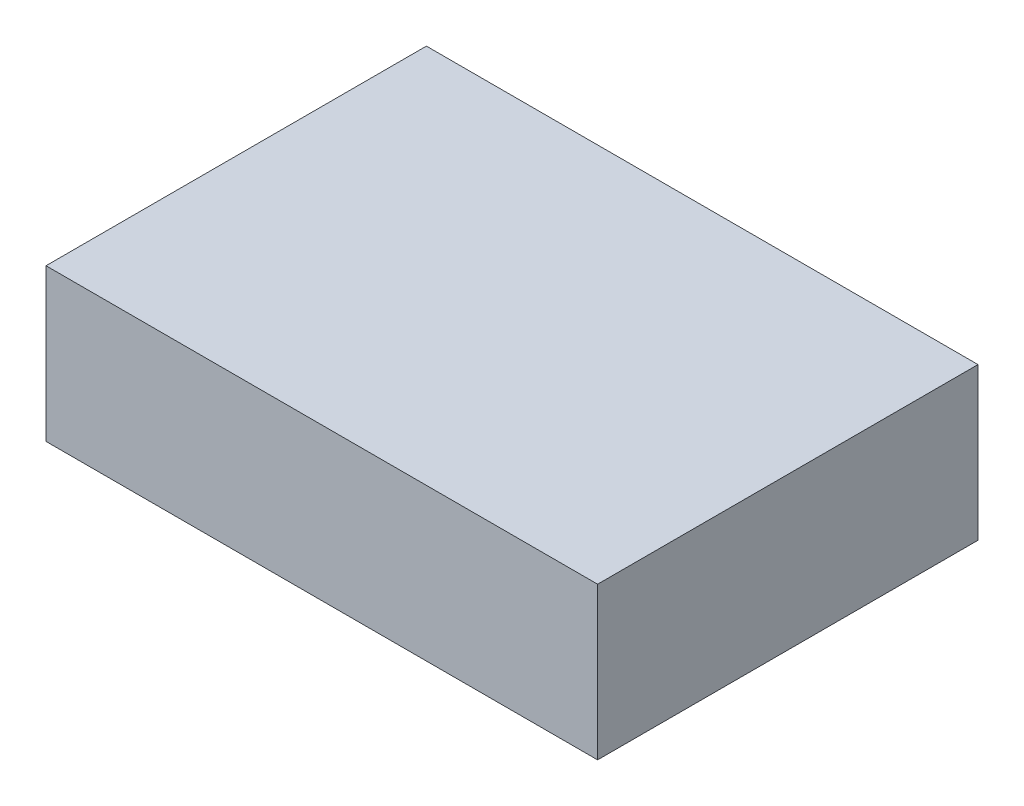
ISO-10303-21;
HEADER;
FILE_DESCRIPTION(('STEP AP214'),'2;1');
FILE_NAME('part.step','',(''),(''),'','','');
FILE_SCHEMA(('AUTOMOTIVE_DESIGN { 1 0 10303 214 1 1 1 1 }'));
ENDSEC;
DATA;
#1=APPLICATION_CONTEXT('core data for automotive mechanical design processes');
#2=APPLICATION_PROTOCOL_DEFINITION('international standard','automotive_design',2000,#1);
#3=PRODUCT_CONTEXT('',#1,'mechanical');
#4=PRODUCT('Part','Part','',(#3));
#5=PRODUCT_RELATED_PRODUCT_CATEGORY('part','',(#4));
#6=PRODUCT_DEFINITION_FORMATION('','',#4);
#7=PRODUCT_DEFINITION_CONTEXT('part definition',#1,'design');
#8=PRODUCT_DEFINITION('design','',#6,#7);
#9=PRODUCT_DEFINITION_SHAPE('','',#8);
#10=(LENGTH_UNIT() NAMED_UNIT(*) SI_UNIT(.MILLI.,.METRE.));
#11=(NAMED_UNIT(*) PLANE_ANGLE_UNIT() SI_UNIT($,.RADIAN.));
#12=(NAMED_UNIT(*) SI_UNIT($,.STERADIAN.) SOLID_ANGLE_UNIT());
#13=UNCERTAINTY_MEASURE_WITH_UNIT(LENGTH_MEASURE(1.E-05),#10,'distance_accuracy_value','');
#14=(GEOMETRIC_REPRESENTATION_CONTEXT(3) GLOBAL_UNCERTAINTY_ASSIGNED_CONTEXT((#13)) GLOBAL_UNIT_ASSIGNED_CONTEXT((#10,
#11,#12)) REPRESENTATION_CONTEXT('',''));
#15=CARTESIAN_POINT('',(0.,0.,0.));
#16=DIRECTION('',(0.,0.,1.));
#17=DIRECTION('',(1.,0.,0.));
#18=AXIS2_PLACEMENT_3D('',#15,#16,#17);
#19=CARTESIAN_POINT('',(0.,0.,0.));
#20=DIRECTION('',(0.,1.,0.));
#21=DIRECTION('',(1.,0.,0.));
#22=AXIS2_PLACEMENT_3D('',#19,#20,#21);
#23=PLANE('',#22);
#24=DIRECTION('',(0.,0.,-1.));
#25=VECTOR('',#24,1.);
#26=CARTESIAN_POINT('',(46.0375,0.,31.75));
#27=LINE('',#26,#25);
#28=CARTESIAN_POINT('',(46.0375,0.,31.75));
#29=VERTEX_POINT('',#28);
#30=CARTESIAN_POINT('',(46.0375,0.,-31.75));
#31=VERTEX_POINT('',#30);
#32=EDGE_CURVE('E21',#29,#31,#27,.T.);
#33=ORIENTED_EDGE('',*,*,#32,.F.);
#34=DIRECTION('',(1.,0.,0.));
#35=VECTOR('',#34,1.);
#36=CARTESIAN_POINT('',(-46.0375,0.,31.75));
#37=LINE('',#36,#35);
#38=CARTESIAN_POINT('',(-46.0375,0.,31.75));
#39=VERTEX_POINT('',#38);
#40=EDGE_CURVE('E73',#39,#29,#37,.T.);
#41=ORIENTED_EDGE('',*,*,#40,.F.);
#42=DIRECTION('',(0.,0.,1.));
#43=VECTOR('',#42,1.);
#44=CARTESIAN_POINT('',(-46.0375,0.,-31.75));
#45=LINE('',#44,#43);
#46=CARTESIAN_POINT('',(-46.0375,0.,-31.75));
#47=VERTEX_POINT('',#46);
#48=EDGE_CURVE('E94',#47,#39,#45,.T.);
#49=ORIENTED_EDGE('',*,*,#48,.F.);
#50=DIRECTION('',(-1.,0.,0.));
#51=VECTOR('',#50,1.);
#52=CARTESIAN_POINT('',(46.0375,0.,-31.75));
#53=LINE('',#52,#51);
#54=EDGE_CURVE('E74',#31,#47,#53,.T.);
#55=ORIENTED_EDGE('',*,*,#54,.F.);
#56=EDGE_LOOP('',(#33,#41,#49,#55));
#57=FACE_BOUND('',#56,.T.);
#58=ADVANCED_FACE('F17',(#57),#23,.F.);
#59=CARTESIAN_POINT('',(0.,25.4,0.));
#60=DIRECTION('',(0.,1.,0.));
#61=DIRECTION('',(1.,0.,0.));
#62=AXIS2_PLACEMENT_3D('',#59,#60,#61);
#63=PLANE('',#62);
#64=DIRECTION('',(0.,0.,-1.));
#65=VECTOR('',#64,1.);
#66=CARTESIAN_POINT('',(46.0375,25.4,31.75));
#67=LINE('',#66,#65);
#68=CARTESIAN_POINT('',(46.0375,25.4,31.75));
#69=VERTEX_POINT('',#68);
#70=CARTESIAN_POINT('',(46.0375,25.4,-31.75));
#71=VERTEX_POINT('',#70);
#72=EDGE_CURVE('E11',#69,#71,#67,.T.);
#73=ORIENTED_EDGE('',*,*,#72,.T.);
#74=DIRECTION('',(-1.,0.,0.));
#75=VECTOR('',#74,1.);
#76=CARTESIAN_POINT('',(46.0375,25.4,-31.75));
#77=LINE('',#76,#75);
#78=CARTESIAN_POINT('',(-46.0375,25.4,-31.75));
#79=VERTEX_POINT('',#78);
#80=EDGE_CURVE('E109',#71,#79,#77,.T.);
#81=ORIENTED_EDGE('',*,*,#80,.T.);
#82=DIRECTION('',(0.,0.,1.));
#83=VECTOR('',#82,1.);
#84=CARTESIAN_POINT('',(-46.0375,25.4,-31.75));
#85=LINE('',#84,#83);
#86=CARTESIAN_POINT('',(-46.0375,25.4,31.75));
#87=VERTEX_POINT('',#86);
#88=EDGE_CURVE('E100',#79,#87,#85,.T.);
#89=ORIENTED_EDGE('',*,*,#88,.T.);
#90=DIRECTION('',(1.,0.,0.));
#91=VECTOR('',#90,1.);
#92=CARTESIAN_POINT('',(-46.0375,25.4,31.75));
#93=LINE('',#92,#91);
#94=EDGE_CURVE('E83',#87,#69,#93,.T.);
#95=ORIENTED_EDGE('',*,*,#94,.T.);
#96=EDGE_LOOP('',(#73,#81,#89,#95));
#97=FACE_BOUND('',#96,.T.);
#98=ADVANCED_FACE('F19',(#97),#63,.T.);
#99=CARTESIAN_POINT('',(46.0375,0.,31.75));
#100=DIRECTION('',(1.,0.,0.));
#101=DIRECTION('',(0.,0.,-1.));
#102=AXIS2_PLACEMENT_3D('',#99,#100,#101);
#103=PLANE('',#102);
#104=ORIENTED_EDGE('',*,*,#32,.T.);
#105=DIRECTION('',(0.,1.,0.));
#106=VECTOR('',#105,1.);
#107=CARTESIAN_POINT('',(46.0375,0.,-31.75));
#108=LINE('',#107,#106);
#109=EDGE_CURVE('E76',#31,#71,#108,.T.);
#110=ORIENTED_EDGE('',*,*,#109,.T.);
#111=ORIENTED_EDGE('',*,*,#72,.F.);
#112=DIRECTION('',(0.,1.,0.));
#113=VECTOR('',#112,1.);
#114=CARTESIAN_POINT('',(46.0375,0.,31.75));
#115=LINE('',#114,#113);
#116=EDGE_CURVE('E78',#29,#69,#115,.T.);
#117=ORIENTED_EDGE('',*,*,#116,.F.);
#118=EDGE_LOOP('',(#104,#110,#111,#117));
#119=FACE_BOUND('',#118,.T.);
#120=ADVANCED_FACE('F79',(#119),#103,.T.);
#121=CARTESIAN_POINT('',(46.0375,0.,-31.75));
#122=DIRECTION('',(0.,0.,-1.));
#123=DIRECTION('',(-1.,0.,0.));
#124=AXIS2_PLACEMENT_3D('',#121,#122,#123);
#125=PLANE('',#124);
#126=ORIENTED_EDGE('',*,*,#54,.T.);
#127=DIRECTION('',(0.,1.,0.));
#128=VECTOR('',#127,1.);
#129=CARTESIAN_POINT('',(-46.0375,0.,-31.75));
#130=LINE('',#129,#128);
#131=EDGE_CURVE('E103',#47,#79,#130,.T.);
#132=ORIENTED_EDGE('',*,*,#131,.T.);
#133=ORIENTED_EDGE('',*,*,#80,.F.);
#134=ORIENTED_EDGE('',*,*,#109,.F.);
#135=EDGE_LOOP('',(#126,#132,#133,#134));
#136=FACE_BOUND('',#135,.T.);
#137=ADVANCED_FACE('F115',(#136),#125,.T.);
#138=CARTESIAN_POINT('',(-46.0375,0.,-31.75));
#139=DIRECTION('',(-1.,0.,0.));
#140=DIRECTION('',(0.,1.,0.));
#141=AXIS2_PLACEMENT_3D('',#138,#139,#140);
#142=PLANE('',#141);
#143=ORIENTED_EDGE('',*,*,#48,.T.);
#144=DIRECTION('',(0.,1.,0.));
#145=VECTOR('',#144,1.);
#146=CARTESIAN_POINT('',(-46.0375,0.,31.75));
#147=LINE('',#146,#145);
#148=EDGE_CURVE('E88',#39,#87,#147,.T.);
#149=ORIENTED_EDGE('',*,*,#148,.T.);
#150=ORIENTED_EDGE('',*,*,#88,.F.);
#151=ORIENTED_EDGE('',*,*,#131,.F.);
#152=EDGE_LOOP('',(#143,#149,#150,#151));
#153=FACE_BOUND('',#152,.T.);
#154=ADVANCED_FACE('F119',(#153),#142,.T.);
#155=CARTESIAN_POINT('',(-46.0375,0.,31.75));
#156=DIRECTION('',(0.,0.,1.));
#157=DIRECTION('',(1.,0.,0.));
#158=AXIS2_PLACEMENT_3D('',#155,#156,#157);
#159=PLANE('',#158);
#160=ORIENTED_EDGE('',*,*,#40,.T.);
#161=ORIENTED_EDGE('',*,*,#116,.T.);
#162=ORIENTED_EDGE('',*,*,#94,.F.);
#163=ORIENTED_EDGE('',*,*,#148,.F.);
#164=EDGE_LOOP('',(#160,#161,#162,#163));
#165=FACE_BOUND('',#164,.T.);
#166=ADVANCED_FACE('F86',(#165),#159,.T.);
#167=CLOSED_SHELL('',(#58,#98,#120,#137,#154,#166));
#168=MANIFOLD_SOLID_BREP('B1',#167);
#169=ADVANCED_BREP_SHAPE_REPRESENTATION('',(#18,#168),#14);
#170=SHAPE_DEFINITION_REPRESENTATION(#9,#169);
ENDSEC;
END-ISO-10303-21;
